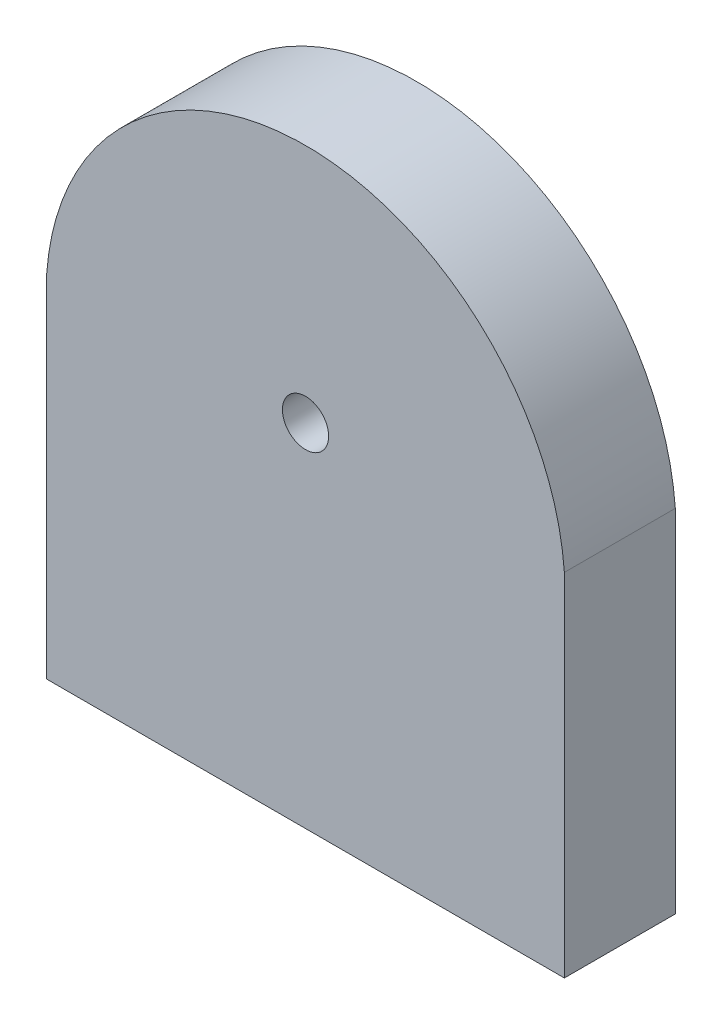
ISO-10303-21;
HEADER;
FILE_DESCRIPTION(('STEP AP214'),'2;1');
FILE_NAME('part.step','',(''),(''),'','','');
FILE_SCHEMA(('AUTOMOTIVE_DESIGN { 1 0 10303 214 1 1 1 1 }'));
ENDSEC;
DATA;
#1=APPLICATION_CONTEXT('core data for automotive mechanical design processes');
#2=APPLICATION_PROTOCOL_DEFINITION('international standard','automotive_design',2000,#1);
#3=PRODUCT_CONTEXT('',#1,'mechanical');
#4=PRODUCT('Part','Part','',(#3));
#5=PRODUCT_RELATED_PRODUCT_CATEGORY('part','',(#4));
#6=PRODUCT_DEFINITION_FORMATION('','',#4);
#7=PRODUCT_DEFINITION_CONTEXT('part definition',#1,'design');
#8=PRODUCT_DEFINITION('design','',#6,#7);
#9=PRODUCT_DEFINITION_SHAPE('','',#8);
#10=(LENGTH_UNIT() NAMED_UNIT(*) SI_UNIT(.MILLI.,.METRE.));
#11=(NAMED_UNIT(*) PLANE_ANGLE_UNIT() SI_UNIT($,.RADIAN.));
#12=(NAMED_UNIT(*) SI_UNIT($,.STERADIAN.) SOLID_ANGLE_UNIT());
#13=UNCERTAINTY_MEASURE_WITH_UNIT(LENGTH_MEASURE(1.E-05),#10,'distance_accuracy_value','');
#14=(GEOMETRIC_REPRESENTATION_CONTEXT(3) GLOBAL_UNCERTAINTY_ASSIGNED_CONTEXT((#13)) GLOBAL_UNIT_ASSIGNED_CONTEXT((#10,
#11,#12)) REPRESENTATION_CONTEXT('',''));
#15=CARTESIAN_POINT('',(0.,0.,0.));
#16=DIRECTION('',(0.,0.,1.));
#17=DIRECTION('',(1.,0.,0.));
#18=AXIS2_PLACEMENT_3D('',#15,#16,#17);
#19=CARTESIAN_POINT('',(0.,0.,6.));
#20=DIRECTION('',(1.,0.,0.));
#21=DIRECTION('',(0.,0.,-1.));
#22=AXIS2_PLACEMENT_3D('',#19,#20,#21);
#23=PLANE('',#22);
#24=DIRECTION('',(0.,-1.,0.));
#25=VECTOR('',#24,1.);
#26=CARTESIAN_POINT('',(0.,0.,6.));
#27=LINE('',#26,#25);
#28=CARTESIAN_POINT('',(0.,19.,6.));
#29=VERTEX_POINT('',#28);
#30=CARTESIAN_POINT('',(0.,0.,6.));
#31=VERTEX_POINT('',#30);
#32=EDGE_CURVE('E84',#29,#31,#27,.T.);
#33=ORIENTED_EDGE('',*,*,#32,.F.);
#34=DIRECTION('',(0.,0.,1.));
#35=VECTOR('',#34,1.);
#36=CARTESIAN_POINT('',(0.,19.,0.));
#37=LINE('',#36,#35);
#38=CARTESIAN_POINT('',(0.,19.,0.));
#39=VERTEX_POINT('',#38);
#40=EDGE_CURVE('E74',#39,#29,#37,.T.);
#41=ORIENTED_EDGE('',*,*,#40,.F.);
#42=DIRECTION('',(0.,-1.,0.));
#43=VECTOR('',#42,1.);
#44=CARTESIAN_POINT('',(0.,0.,0.));
#45=LINE('',#44,#43);
#46=CARTESIAN_POINT('',(0.,0.,0.));
#47=VERTEX_POINT('',#46);
#48=EDGE_CURVE('E60',#39,#47,#45,.T.);
#49=ORIENTED_EDGE('',*,*,#48,.T.);
#50=DIRECTION('',(0.,0.,-1.));
#51=VECTOR('',#50,1.);
#52=CARTESIAN_POINT('',(0.,0.,6.));
#53=LINE('',#52,#51);
#54=EDGE_CURVE('E41',#31,#47,#53,.T.);
#55=ORIENTED_EDGE('',*,*,#54,.F.);
#56=EDGE_LOOP('',(#33,#41,#49,#55));
#57=FACE_BOUND('',#56,.T.);
#58=ADVANCED_FACE('F33',(#57),#23,.F.);
#59=CARTESIAN_POINT('',(0.,0.,6.));
#60=DIRECTION('',(0.,1.,0.));
#61=DIRECTION('',(0.,0.,1.));
#62=AXIS2_PLACEMENT_3D('',#59,#60,#61);
#63=PLANE('',#62);
#64=CARTESIAN_POINT('',(22.,0.,3.));
#65=DIRECTION('',(0.,-1.,0.));
#66=DIRECTION('',(0.,0.,1.));
#67=AXIS2_PLACEMENT_3D('',#64,#65,#66);
#68=CIRCLE('',#67,1.25);
#69=CARTESIAN_POINT('',(22.,0.,4.25));
#70=VERTEX_POINT('',#69);
#71=EDGE_CURVE('E115',#70,#70,#68,.T.);
#72=ORIENTED_EDGE('',*,*,#71,.F.);
#73=EDGE_LOOP('',(#72));
#74=FACE_BOUND('',#73,.T.);
#75=CARTESIAN_POINT('',(6.,0.,3.));
#76=DIRECTION('',(0.,-1.,0.));
#77=DIRECTION('',(0.,0.,-1.));
#78=AXIS2_PLACEMENT_3D('',#75,#76,#77);
#79=CIRCLE('',#78,1.25);
#80=CARTESIAN_POINT('',(6.,0.,1.75));
#81=VERTEX_POINT('',#80);
#82=EDGE_CURVE('E96',#81,#81,#79,.T.);
#83=ORIENTED_EDGE('',*,*,#82,.F.);
#84=EDGE_LOOP('',(#83));
#85=FACE_BOUND('',#84,.T.);
#86=DIRECTION('',(1.,0.,0.));
#87=VECTOR('',#86,1.);
#88=CARTESIAN_POINT('',(0.,0.,0.));
#89=LINE('',#88,#87);
#90=CARTESIAN_POINT('',(28.,0.,0.));
#91=VERTEX_POINT('',#90);
#92=EDGE_CURVE('E93',#47,#91,#89,.T.);
#93=ORIENTED_EDGE('',*,*,#92,.T.);
#94=DIRECTION('',(0.,0.,-1.));
#95=VECTOR('',#94,1.);
#96=CARTESIAN_POINT('',(28.,0.,6.));
#97=LINE('',#96,#95);
#98=CARTESIAN_POINT('',(28.,0.,6.));
#99=VERTEX_POINT('',#98);
#100=EDGE_CURVE('E100',#99,#91,#97,.T.);
#101=ORIENTED_EDGE('',*,*,#100,.F.);
#102=DIRECTION('',(1.,0.,0.));
#103=VECTOR('',#102,1.);
#104=CARTESIAN_POINT('',(0.,0.,6.));
#105=LINE('',#104,#103);
#106=EDGE_CURVE('E49',#31,#99,#105,.T.);
#107=ORIENTED_EDGE('',*,*,#106,.F.);
#108=ORIENTED_EDGE('',*,*,#54,.T.);
#109=EDGE_LOOP('',(#93,#101,#107,#108));
#110=FACE_BOUND('',#109,.T.);
#111=ADVANCED_FACE('F106',(#74,#85,#110),#63,.F.);
#112=CARTESIAN_POINT('',(28.,0.,6.));
#113=DIRECTION('',(-1.,0.,0.));
#114=DIRECTION('',(0.,0.,1.));
#115=AXIS2_PLACEMENT_3D('',#112,#113,#114);
#116=PLANE('',#115);
#117=DIRECTION('',(0.,1.,0.));
#118=VECTOR('',#117,1.);
#119=CARTESIAN_POINT('',(28.,0.,0.));
#120=LINE('',#119,#118);
#121=CARTESIAN_POINT('',(28.,19.,0.));
#122=VERTEX_POINT('',#121);
#123=EDGE_CURVE('E89',#91,#122,#120,.T.);
#124=ORIENTED_EDGE('',*,*,#123,.T.);
#125=DIRECTION('',(0.,0.,1.));
#126=VECTOR('',#125,1.);
#127=CARTESIAN_POINT('',(28.,19.,0.));
#128=LINE('',#127,#126);
#129=CARTESIAN_POINT('',(28.,19.,6.));
#130=VERTEX_POINT('',#129);
#131=EDGE_CURVE('E81',#122,#130,#128,.T.);
#132=ORIENTED_EDGE('',*,*,#131,.T.);
#133=DIRECTION('',(0.,1.,0.));
#134=VECTOR('',#133,1.);
#135=CARTESIAN_POINT('',(28.,0.,6.));
#136=LINE('',#135,#134);
#137=EDGE_CURVE('E86',#99,#130,#136,.T.);
#138=ORIENTED_EDGE('',*,*,#137,.F.);
#139=ORIENTED_EDGE('',*,*,#100,.T.);
#140=EDGE_LOOP('',(#124,#132,#138,#139));
#141=FACE_BOUND('',#140,.T.);
#142=ADVANCED_FACE('F109',(#141),#116,.F.);
#143=CARTESIAN_POINT('',(0.,0.,6.));
#144=DIRECTION('',(0.,0.,-1.));
#145=DIRECTION('',(-1.,0.,0.));
#146=AXIS2_PLACEMENT_3D('',#143,#144,#145);
#147=PLANE('',#146);
#148=CARTESIAN_POINT('',(14.,19.,6.));
#149=DIRECTION('',(0.,0.,1.));
#150=DIRECTION('',(1.,0.,0.));
#151=AXIS2_PLACEMENT_3D('',#148,#149,#150);
#152=CIRCLE('',#151,1.25);
#153=CARTESIAN_POINT('',(15.25,19.,6.));
#154=VERTEX_POINT('',#153);
#155=EDGE_CURVE('E80',#154,#154,#152,.T.);
#156=ORIENTED_EDGE('',*,*,#155,.F.);
#157=EDGE_LOOP('',(#156));
#158=FACE_BOUND('',#157,.T.);
#159=ORIENTED_EDGE('',*,*,#137,.T.);
#160=CARTESIAN_POINT('',(14.,17.9615384615385,6.));
#161=DIRECTION('',(0.,0.,-1.));
#162=DIRECTION('',(-1.,0.,0.));
#163=AXIS2_PLACEMENT_3D('',#160,#161,#162);
#164=CIRCLE('',#163,14.0384615384615);
#165=EDGE_CURVE('E77',#29,#130,#164,.T.);
#166=ORIENTED_EDGE('',*,*,#165,.F.);
#167=ORIENTED_EDGE('',*,*,#32,.T.);
#168=ORIENTED_EDGE('',*,*,#106,.T.);
#169=EDGE_LOOP('',(#159,#166,#167,#168));
#170=FACE_BOUND('',#169,.T.);
#171=ADVANCED_FACE('F83',(#158,#170),#147,.F.);
#172=CARTESIAN_POINT('',(0.,0.,0.));
#173=DIRECTION('',(0.,0.,-1.));
#174=DIRECTION('',(-1.,0.,0.));
#175=AXIS2_PLACEMENT_3D('',#172,#173,#174);
#176=PLANE('',#175);
#177=CARTESIAN_POINT('',(14.,17.9615384615385,0.));
#178=DIRECTION('',(0.,0.,-1.));
#179=DIRECTION('',(-1.,0.,0.));
#180=AXIS2_PLACEMENT_3D('',#177,#178,#179);
#181=CIRCLE('',#180,14.0384615384615);
#182=EDGE_CURVE('E11',#122,#39,#181,.F.);
#183=ORIENTED_EDGE('',*,*,#182,.F.);
#184=ORIENTED_EDGE('',*,*,#123,.F.);
#185=ORIENTED_EDGE('',*,*,#92,.F.);
#186=ORIENTED_EDGE('',*,*,#48,.F.);
#187=EDGE_LOOP('',(#183,#184,#185,#186));
#188=FACE_BOUND('',#187,.T.);
#189=CARTESIAN_POINT('',(14.,19.,0.));
#190=DIRECTION('',(0.,0.,1.));
#191=DIRECTION('',(1.,0.,0.));
#192=AXIS2_PLACEMENT_3D('',#189,#190,#191);
#193=CIRCLE('',#192,1.25);
#194=CARTESIAN_POINT('',(15.25,19.,0.));
#195=VERTEX_POINT('',#194);
#196=EDGE_CURVE('E112',#195,#195,#193,.T.);
#197=ORIENTED_EDGE('',*,*,#196,.T.);
#198=EDGE_LOOP('',(#197));
#199=FACE_BOUND('',#198,.T.);
#200=ADVANCED_FACE('F139',(#188,#199),#176,.T.);
#201=CARTESIAN_POINT('',(6.,10.,3.));
#202=DIRECTION('',(0.,-1.,0.));
#203=DIRECTION('',(0.,0.,-1.));
#204=AXIS2_PLACEMENT_3D('',#201,#202,#203);
#205=CYLINDRICAL_SURFACE('',#204,1.25);
#206=CARTESIAN_POINT('',(6.,10.,3.));
#207=DIRECTION('',(0.,-1.,0.));
#208=DIRECTION('',(0.,0.,-1.));
#209=AXIS2_PLACEMENT_3D('',#206,#207,#208);
#210=CIRCLE('',#209,1.25);
#211=CARTESIAN_POINT('',(6.,10.,1.75));
#212=VERTEX_POINT('',#211);
#213=EDGE_CURVE('E102',#212,#212,#210,.T.);
#214=ORIENTED_EDGE('',*,*,#213,.F.);
#215=EDGE_LOOP('',(#214));
#216=FACE_BOUND('',#215,.T.);
#217=ORIENTED_EDGE('',*,*,#82,.T.);
#218=EDGE_LOOP('',(#217));
#219=FACE_BOUND('',#218,.T.);
#220=ADVANCED_FACE('F128',(#216,#219),#205,.F.);
#221=CARTESIAN_POINT('',(6.,10.,3.));
#222=DIRECTION('',(0.,-1.,0.));
#223=DIRECTION('',(0.,0.,-1.));
#224=AXIS2_PLACEMENT_3D('',#221,#222,#223);
#225=PLANE('',#224);
#226=ORIENTED_EDGE('',*,*,#213,.T.);
#227=EDGE_LOOP('',(#226));
#228=FACE_BOUND('',#227,.T.);
#229=ADVANCED_FACE('F148',(#228),#225,.T.);
#230=CARTESIAN_POINT('',(22.,10.,3.));
#231=DIRECTION('',(0.,-1.,0.));
#232=DIRECTION('',(0.,0.,-1.));
#233=AXIS2_PLACEMENT_3D('',#230,#231,#232);
#234=CYLINDRICAL_SURFACE('',#233,1.25);
#235=CARTESIAN_POINT('',(22.,10.,3.));
#236=DIRECTION('',(0.,-1.,0.));
#237=DIRECTION('',(0.,0.,1.));
#238=AXIS2_PLACEMENT_3D('',#235,#236,#237);
#239=CIRCLE('',#238,1.25);
#240=CARTESIAN_POINT('',(22.,10.,4.25));
#241=VERTEX_POINT('',#240);
#242=EDGE_CURVE('E118',#241,#241,#239,.T.);
#243=ORIENTED_EDGE('',*,*,#242,.F.);
#244=EDGE_LOOP('',(#243));
#245=FACE_BOUND('',#244,.T.);
#246=ORIENTED_EDGE('',*,*,#71,.T.);
#247=EDGE_LOOP('',(#246));
#248=FACE_BOUND('',#247,.T.);
#249=ADVANCED_FACE('F152',(#245,#248),#234,.F.);
#250=CARTESIAN_POINT('',(22.,10.,3.));
#251=DIRECTION('',(0.,1.,0.));
#252=DIRECTION('',(0.,0.,1.));
#253=AXIS2_PLACEMENT_3D('',#250,#251,#252);
#254=PLANE('',#253);
#255=ORIENTED_EDGE('',*,*,#242,.T.);
#256=EDGE_LOOP('',(#255));
#257=FACE_BOUND('',#256,.T.);
#258=ADVANCED_FACE('F155',(#257),#254,.F.);
#259=CARTESIAN_POINT('',(14.,19.,0.));
#260=DIRECTION('',(0.,0.,1.));
#261=DIRECTION('',(1.,0.,0.));
#262=AXIS2_PLACEMENT_3D('',#259,#260,#261);
#263=CYLINDRICAL_SURFACE('',#262,1.25);
#264=ORIENTED_EDGE('',*,*,#196,.F.);
#265=EDGE_LOOP('',(#264));
#266=FACE_BOUND('',#265,.T.);
#267=ORIENTED_EDGE('',*,*,#155,.T.);
#268=EDGE_LOOP('',(#267));
#269=FACE_BOUND('',#268,.T.);
#270=ADVANCED_FACE('F159',(#266,#269),#263,.F.);
#271=CARTESIAN_POINT('',(14.,17.9615384615385,0.));
#272=DIRECTION('',(0.,0.,1.));
#273=DIRECTION('',(1.,0.,0.));
#274=AXIS2_PLACEMENT_3D('',#271,#272,#273);
#275=CYLINDRICAL_SURFACE('',#274,14.0384615384615);
#276=ORIENTED_EDGE('',*,*,#165,.T.);
#277=ORIENTED_EDGE('',*,*,#131,.F.);
#278=ORIENTED_EDGE('',*,*,#182,.T.);
#279=ORIENTED_EDGE('',*,*,#40,.T.);
#280=EDGE_LOOP('',(#276,#277,#278,#279));
#281=FACE_BOUND('',#280,.T.);
#282=ADVANCED_FACE('F76',(#281),#275,.T.);
#283=CLOSED_SHELL('',(#58,#111,#142,#171,#200,#220,#229,#249,#258,#270,#282));
#284=MANIFOLD_SOLID_BREP('B2',#283);
#285=ADVANCED_BREP_SHAPE_REPRESENTATION('',(#18,#284),#14);
#286=SHAPE_DEFINITION_REPRESENTATION(#9,#285);
ENDSEC;
END-ISO-10303-21;
